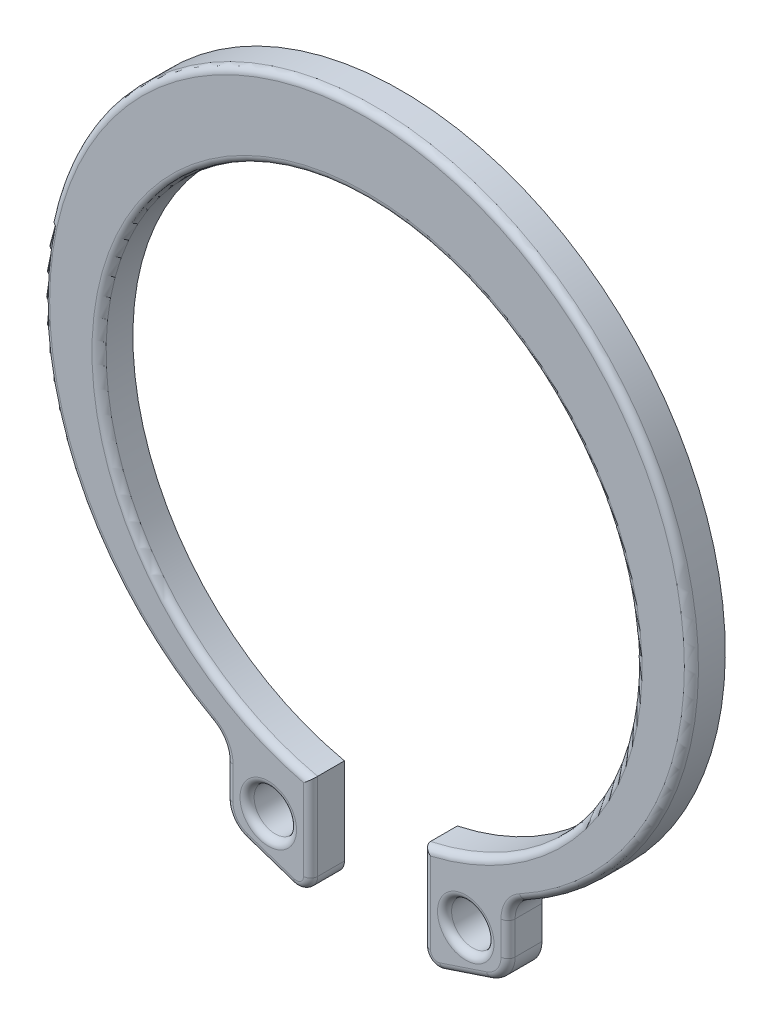
ISO-10303-21;
HEADER;
FILE_DESCRIPTION(('STEP AP214'),'2;1');
FILE_NAME('part.step','',(''),(''),'','','');
FILE_SCHEMA(('AUTOMOTIVE_DESIGN { 1 0 10303 214 1 1 1 1 }'));
ENDSEC;
DATA;
#1=APPLICATION_CONTEXT('core data for automotive mechanical design processes');
#2=APPLICATION_PROTOCOL_DEFINITION('international standard','automotive_design',2000,#1);
#3=PRODUCT_CONTEXT('',#1,'mechanical');
#4=PRODUCT('Part','Part','',(#3));
#5=PRODUCT_RELATED_PRODUCT_CATEGORY('part','',(#4));
#6=PRODUCT_DEFINITION_FORMATION('','',#4);
#7=PRODUCT_DEFINITION_CONTEXT('part definition',#1,'design');
#8=PRODUCT_DEFINITION('design','',#6,#7);
#9=PRODUCT_DEFINITION_SHAPE('','',#8);
#10=(LENGTH_UNIT() NAMED_UNIT(*) SI_UNIT(.MILLI.,.METRE.));
#11=(NAMED_UNIT(*) PLANE_ANGLE_UNIT() SI_UNIT($,.RADIAN.));
#12=(NAMED_UNIT(*) SI_UNIT($,.STERADIAN.) SOLID_ANGLE_UNIT());
#13=UNCERTAINTY_MEASURE_WITH_UNIT(LENGTH_MEASURE(1.E-05),#10,'distance_accuracy_value','');
#14=(GEOMETRIC_REPRESENTATION_CONTEXT(3) GLOBAL_UNCERTAINTY_ASSIGNED_CONTEXT((#13)) GLOBAL_UNIT_ASSIGNED_CONTEXT((#10,
#11,#12)) REPRESENTATION_CONTEXT('',''));
#15=CARTESIAN_POINT('',(0.,0.,0.));
#16=DIRECTION('',(0.,0.,1.));
#17=DIRECTION('',(1.,0.,0.));
#18=AXIS2_PLACEMENT_3D('',#15,#16,#17);
#19=CARTESIAN_POINT('',(-6.,-10.1658560997307,1.2));
#20=DIRECTION('',(0.,0.,1.));
#21=DIRECTION('',(1.,0.,0.));
#22=AXIS2_PLACEMENT_3D('',#19,#20,#21);
#23=PLANE('',#22);
#24=CARTESIAN_POINT('',(3.5,-11.056157588604,1.2));
#25=DIRECTION('',(0.,0.,1.));
#26=DIRECTION('',(1.,0.,0.));
#27=AXIS2_PLACEMENT_3D('',#24,#25,#26);
#28=CIRCLE('',#27,1.00163990877947);
#29=CARTESIAN_POINT('',(4.50163990877946,-11.056157588604,1.2));
#30=VERTEX_POINT('',#29);
#31=EDGE_CURVE('E304',#30,#30,#28,.F.);
#32=ORIENTED_EDGE('',*,*,#31,.T.);
#33=EDGE_LOOP('',(#32));
#34=FACE_BOUND('',#33,.T.);
#35=CARTESIAN_POINT('',(6.,-10.1658560997307,1.2));
#36=DIRECTION('',(0.,0.,1.));
#37=DIRECTION('',(1.,0.,0.));
#38=AXIS2_PLACEMENT_3D('',#35,#36,#37);
#39=CIRCLE('',#38,1.25);
#40=CARTESIAN_POINT('',(4.75,-10.1658560997307,1.2));
#41=VERTEX_POINT('',#40);
#42=CARTESIAN_POINT('',(5.4,-9.06927048975759,1.2));
#43=VERTEX_POINT('',#42);
#44=EDGE_CURVE('E299',#41,#43,#39,.F.);
#45=ORIENTED_EDGE('',*,*,#44,.T.);
#46=CARTESIAN_POINT('',(0.,0.8,1.2));
#47=DIRECTION('',(0.,0.,1.));
#48=DIRECTION('',(1.,0.,0.));
#49=AXIS2_PLACEMENT_3D('',#46,#47,#48);
#50=CIRCLE('',#49,11.25);
#51=CARTESIAN_POINT('',(-5.4,-9.06927048975759,1.2));
#52=VERTEX_POINT('',#51);
#53=EDGE_CURVE('E301',#43,#52,#50,.T.);
#54=ORIENTED_EDGE('',*,*,#53,.T.);
#55=CARTESIAN_POINT('',(-6.,-10.1658560997307,1.2));
#56=DIRECTION('',(0.,0.,1.));
#57=DIRECTION('',(1.,0.,0.));
#58=AXIS2_PLACEMENT_3D('',#55,#56,#57);
#59=CIRCLE('',#58,1.25);
#60=CARTESIAN_POINT('',(-4.75,-10.1658560997307,1.2));
#61=VERTEX_POINT('',#60);
#62=EDGE_CURVE('E275',#52,#61,#59,.F.);
#63=ORIENTED_EDGE('',*,*,#62,.T.);
#64=DIRECTION('',(0.,-1.,0.));
#65=VECTOR('',#64,1.);
#66=CARTESIAN_POINT('',(-4.75,-11.3353983685479,1.2));
#67=LINE('',#66,#65);
#68=CARTESIAN_POINT('',(-4.75,-11.3353983685479,1.2));
#69=VERTEX_POINT('',#68);
#70=EDGE_CURVE('E277',#61,#69,#67,.T.);
#71=ORIENTED_EDGE('',*,*,#70,.T.);
#72=CARTESIAN_POINT('',(-4.,-11.3353983685479,1.2));
#73=DIRECTION('',(0.,0.,1.));
#74=DIRECTION('',(1.,0.,0.));
#75=AXIS2_PLACEMENT_3D('',#72,#73,#74);
#76=CIRCLE('',#75,0.75);
#77=CARTESIAN_POINT('',(-4.23717082451262,-12.0469108420858,1.2));
#78=VERTEX_POINT('',#77);
#79=EDGE_CURVE('E279',#69,#78,#76,.T.);
#80=ORIENTED_EDGE('',*,*,#79,.T.);
#81=DIRECTION('',(0.948683298050514,-0.316227766016838,0.));
#82=VECTOR('',#81,1.);
#83=CARTESIAN_POINT('',(-2.57905694150421,-12.5996154697552,1.2));
#84=LINE('',#83,#82);
#85=CARTESIAN_POINT('',(-2.57905694150421,-12.5996154697552,1.2));
#86=VERTEX_POINT('',#85);
#87=EDGE_CURVE('E281',#78,#86,#84,.T.);
#88=ORIENTED_EDGE('',*,*,#87,.T.);
#89=CARTESIAN_POINT('',(-2.5,-12.3624446452426,1.2));
#90=DIRECTION('',(0.,0.,1.));
#91=DIRECTION('',(1.,0.,0.));
#92=AXIS2_PLACEMENT_3D('',#89,#90,#91);
#93=CIRCLE('',#92,0.250000000000001);
#94=CARTESIAN_POINT('',(-2.25,-12.3624446452426,1.2));
#95=VERTEX_POINT('',#94);
#96=EDGE_CURVE('E283',#86,#95,#93,.T.);
#97=ORIENTED_EDGE('',*,*,#96,.T.);
#98=DIRECTION('',(0.,1.,0.));
#99=VECTOR('',#98,1.);
#100=CARTESIAN_POINT('',(-2.25,-9.28708781050335,1.2));
#101=LINE('',#100,#99);
#102=CARTESIAN_POINT('',(-2.25,-9.48683298050514,1.2));
#103=VERTEX_POINT('',#102);
#104=EDGE_CURVE('E285',#95,#103,#101,.T.);
#105=ORIENTED_EDGE('',*,*,#104,.T.);
#106=CARTESIAN_POINT('',(0.,0.,1.2));
#107=DIRECTION('',(0.,0.,1.));
#108=DIRECTION('',(1.,0.,0.));
#109=AXIS2_PLACEMENT_3D('',#106,#107,#108);
#110=CIRCLE('',#109,9.75);
#111=CARTESIAN_POINT('',(2.25000000000001,-9.48683298050514,1.2));
#112=VERTEX_POINT('',#111);
#113=EDGE_CURVE('E287',#103,#112,#110,.F.);
#114=ORIENTED_EDGE('',*,*,#113,.T.);
#115=DIRECTION('',(0.,-1.,0.));
#116=VECTOR('',#115,1.);
#117=CARTESIAN_POINT('',(2.25,-12.3624446452426,1.2));
#118=LINE('',#117,#116);
#119=CARTESIAN_POINT('',(2.25,-12.3624446452426,1.2));
#120=VERTEX_POINT('',#119);
#121=EDGE_CURVE('E289',#112,#120,#118,.T.);
#122=ORIENTED_EDGE('',*,*,#121,.T.);
#123=CARTESIAN_POINT('',(2.5,-12.3624446452426,1.2));
#124=DIRECTION('',(0.,0.,1.));
#125=DIRECTION('',(1.,0.,0.));
#126=AXIS2_PLACEMENT_3D('',#123,#124,#125);
#127=CIRCLE('',#126,0.25);
#128=CARTESIAN_POINT('',(2.57905694150421,-12.5996154697552,1.2));
#129=VERTEX_POINT('',#128);
#130=EDGE_CURVE('E291',#120,#129,#127,.T.);
#131=ORIENTED_EDGE('',*,*,#130,.T.);
#132=DIRECTION('',(0.948683298050514,0.316227766016837,0.));
#133=VECTOR('',#132,1.);
#134=CARTESIAN_POINT('',(4.23717082451262,-12.0469108420858,1.2));
#135=LINE('',#134,#133);
#136=CARTESIAN_POINT('',(4.23717082451262,-12.0469108420858,1.2));
#137=VERTEX_POINT('',#136);
#138=EDGE_CURVE('E293',#129,#137,#135,.T.);
#139=ORIENTED_EDGE('',*,*,#138,.T.);
#140=CARTESIAN_POINT('',(4.,-11.3353983685479,1.2));
#141=DIRECTION('',(0.,0.,1.));
#142=DIRECTION('',(1.,0.,0.));
#143=AXIS2_PLACEMENT_3D('',#140,#141,#142);
#144=CIRCLE('',#143,0.75);
#145=CARTESIAN_POINT('',(4.75,-11.3353983685479,1.2));
#146=VERTEX_POINT('',#145);
#147=EDGE_CURVE('E295',#137,#146,#144,.T.);
#148=ORIENTED_EDGE('',*,*,#147,.T.);
#149=DIRECTION('',(0.,1.,0.));
#150=VECTOR('',#149,1.);
#151=CARTESIAN_POINT('',(4.75,-10.1658560997307,1.2));
#152=LINE('',#151,#150);
#153=EDGE_CURVE('E297',#146,#41,#152,.T.);
#154=ORIENTED_EDGE('',*,*,#153,.T.);
#155=EDGE_LOOP('',(#45,#54,#63,#71,#80,#88,#97,#105,#114,#122,#131,#139,#148,#154));
#156=FACE_BOUND('',#155,.T.);
#157=CARTESIAN_POINT('',(-3.5,-11.056157588604,1.2));
#158=DIRECTION('',(0.,0.,1.));
#159=DIRECTION('',(1.,0.,0.));
#160=AXIS2_PLACEMENT_3D('',#157,#158,#159);
#161=CIRCLE('',#160,1.00163990877947);
#162=CARTESIAN_POINT('',(-2.49836009122053,-11.056157588604,1.2));
#163=VERTEX_POINT('',#162);
#164=EDGE_CURVE('E272',#163,#163,#161,.F.);
#165=ORIENTED_EDGE('',*,*,#164,.T.);
#166=EDGE_LOOP('',(#165));
#167=FACE_BOUND('',#166,.T.);
#168=ADVANCED_FACE('F32',(#34,#156,#167),#23,.T.);
#169=CARTESIAN_POINT('',(-6.,-10.1658560997307,0.));
#170=DIRECTION('',(0.,0.,1.));
#171=DIRECTION('',(1.,0.,0.));
#172=AXIS2_PLACEMENT_3D('',#169,#170,#171);
#173=PLANE('',#172);
#174=CARTESIAN_POINT('',(-6.,-10.1658560997307,0.));
#175=DIRECTION('',(0.,0.,-1.));
#176=DIRECTION('',(1.,0.,0.));
#177=AXIS2_PLACEMENT_3D('',#174,#175,#176);
#178=CIRCLE('',#177,1.);
#179=CARTESIAN_POINT('',(-5.52,-9.28858761175221,0.));
#180=VERTEX_POINT('',#179);
#181=CARTESIAN_POINT('',(-5.,-10.1658560997307,0.));
#182=VERTEX_POINT('',#181);
#183=EDGE_CURVE('E197',#180,#182,#178,.T.);
#184=ORIENTED_EDGE('',*,*,#183,.F.);
#185=CARTESIAN_POINT('',(0.,0.8,0.));
#186=DIRECTION('',(0.,0.,1.));
#187=DIRECTION('',(1.,0.,0.));
#188=AXIS2_PLACEMENT_3D('',#185,#186,#187);
#189=CIRCLE('',#188,11.5);
#190=CARTESIAN_POINT('',(5.52,-9.28858761175221,0.));
#191=VERTEX_POINT('',#190);
#192=EDGE_CURVE('E244',#191,#180,#189,.T.);
#193=ORIENTED_EDGE('',*,*,#192,.F.);
#194=CARTESIAN_POINT('',(6.,-10.1658560997307,0.));
#195=DIRECTION('',(0.,0.,-1.));
#196=DIRECTION('',(-1.,0.,0.));
#197=AXIS2_PLACEMENT_3D('',#194,#195,#196);
#198=CIRCLE('',#197,1.);
#199=CARTESIAN_POINT('',(5.,-10.1658560997307,0.));
#200=VERTEX_POINT('',#199);
#201=EDGE_CURVE('E241',#200,#191,#198,.T.);
#202=ORIENTED_EDGE('',*,*,#201,.F.);
#203=DIRECTION('',(0.,1.,0.));
#204=VECTOR('',#203,1.);
#205=CARTESIAN_POINT('',(5.,-11.3353983685479,0.));
#206=LINE('',#205,#204);
#207=CARTESIAN_POINT('',(5.,-11.3353983685479,0.));
#208=VERTEX_POINT('',#207);
#209=EDGE_CURVE('E238',#208,#200,#206,.T.);
#210=ORIENTED_EDGE('',*,*,#209,.F.);
#211=CARTESIAN_POINT('',(4.,-11.3353983685479,0.));
#212=DIRECTION('',(0.,0.,1.));
#213=DIRECTION('',(-1.,0.,0.));
#214=AXIS2_PLACEMENT_3D('',#211,#212,#213);
#215=CIRCLE('',#214,1.);
#216=CARTESIAN_POINT('',(4.31622776601683,-12.2840816665984,0.));
#217=VERTEX_POINT('',#216);
#218=EDGE_CURVE('E235',#217,#208,#215,.T.);
#219=ORIENTED_EDGE('',*,*,#218,.F.);
#220=DIRECTION('',(0.948683298050514,0.316227766016837,0.));
#221=VECTOR('',#220,1.);
#222=CARTESIAN_POINT('',(2.65811388300842,-12.8367862942678,0.));
#223=LINE('',#222,#221);
#224=CARTESIAN_POINT('',(2.65811388300842,-12.8367862942678,0.));
#225=VERTEX_POINT('',#224);
#226=EDGE_CURVE('E232',#225,#217,#223,.T.);
#227=ORIENTED_EDGE('',*,*,#226,.F.);
#228=CARTESIAN_POINT('',(2.5,-12.3624446452426,0.));
#229=DIRECTION('',(0.,0.,1.));
#230=DIRECTION('',(-1.,0.,0.));
#231=AXIS2_PLACEMENT_3D('',#228,#229,#230);
#232=CIRCLE('',#231,0.5);
#233=CARTESIAN_POINT('',(2.,-12.3624446452426,0.));
#234=VERTEX_POINT('',#233);
#235=EDGE_CURVE('E229',#234,#225,#232,.T.);
#236=ORIENTED_EDGE('',*,*,#235,.F.);
#237=DIRECTION('',(0.,-1.,0.));
#238=VECTOR('',#237,1.);
#239=CARTESIAN_POINT('',(2.,-10.5247516529061,0.));
#240=LINE('',#239,#238);
#241=CARTESIAN_POINT('',(2.,-9.28708781050335,0.));
#242=VERTEX_POINT('',#241);
#243=EDGE_CURVE('E226',#242,#234,#240,.T.);
#244=ORIENTED_EDGE('',*,*,#243,.F.);
#245=CARTESIAN_POINT('',(0.,0.,0.));
#246=DIRECTION('',(0.,0.,-1.));
#247=DIRECTION('',(1.,0.,0.));
#248=AXIS2_PLACEMENT_3D('',#245,#246,#247);
#249=CIRCLE('',#248,9.5);
#250=CARTESIAN_POINT('',(-2.,-9.28708781050335,0.));
#251=VERTEX_POINT('',#250);
#252=EDGE_CURVE('E223',#251,#242,#249,.T.);
#253=ORIENTED_EDGE('',*,*,#252,.F.);
#254=DIRECTION('',(0.,1.,0.));
#255=VECTOR('',#254,1.);
#256=CARTESIAN_POINT('',(-2.,-9.28708781050335,0.));
#257=LINE('',#256,#255);
#258=CARTESIAN_POINT('',(-2.,-12.3624446452426,0.));
#259=VERTEX_POINT('',#258);
#260=EDGE_CURVE('E220',#259,#251,#257,.T.);
#261=ORIENTED_EDGE('',*,*,#260,.F.);
#262=CARTESIAN_POINT('',(-2.5,-12.3624446452426,0.));
#263=DIRECTION('',(0.,0.,1.));
#264=DIRECTION('',(-1.,0.,0.));
#265=AXIS2_PLACEMENT_3D('',#262,#263,#264);
#266=CIRCLE('',#265,0.500000000000001);
#267=CARTESIAN_POINT('',(-2.65811388300842,-12.8367862942679,0.));
#268=VERTEX_POINT('',#267);
#269=EDGE_CURVE('E217',#268,#259,#266,.T.);
#270=ORIENTED_EDGE('',*,*,#269,.F.);
#271=DIRECTION('',(0.948683298050514,-0.316227766016838,0.));
#272=VECTOR('',#271,1.);
#273=CARTESIAN_POINT('',(-2.65811388300842,-12.8367862942679,0.));
#274=LINE('',#273,#272);
#275=CARTESIAN_POINT('',(-4.31622776601683,-12.2840816665984,0.));
#276=VERTEX_POINT('',#275);
#277=EDGE_CURVE('E214',#276,#268,#274,.T.);
#278=ORIENTED_EDGE('',*,*,#277,.F.);
#279=CARTESIAN_POINT('',(-4.,-11.3353983685479,0.));
#280=DIRECTION('',(0.,0.,1.));
#281=DIRECTION('',(-1.,0.,0.));
#282=AXIS2_PLACEMENT_3D('',#279,#280,#281);
#283=CIRCLE('',#282,1.);
#284=CARTESIAN_POINT('',(-5.,-11.3353983685479,0.));
#285=VERTEX_POINT('',#284);
#286=EDGE_CURVE('E200',#285,#276,#283,.T.);
#287=ORIENTED_EDGE('',*,*,#286,.F.);
#288=DIRECTION('',(0.,-1.,0.));
#289=VECTOR('',#288,1.);
#290=CARTESIAN_POINT('',(-5.,-11.3353983685479,0.));
#291=LINE('',#290,#289);
#292=EDGE_CURVE('E184',#182,#285,#291,.T.);
#293=ORIENTED_EDGE('',*,*,#292,.F.);
#294=EDGE_LOOP('',(#184,#193,#202,#210,#219,#227,#236,#244,#253,#261,#270,#278,#287,#293));
#295=FACE_BOUND('',#294,.T.);
#296=CARTESIAN_POINT('',(-3.5,-11.056157588604,0.));
#297=DIRECTION('',(0.,0.,1.));
#298=DIRECTION('',(1.,0.,0.));
#299=AXIS2_PLACEMENT_3D('',#296,#297,#298);
#300=CIRCLE('',#299,0.751639908779466);
#301=CARTESIAN_POINT('',(-2.74836009122053,-11.056157588604,0.));
#302=VERTEX_POINT('',#301);
#303=EDGE_CURVE('E206',#302,#302,#300,.T.);
#304=ORIENTED_EDGE('',*,*,#303,.T.);
#305=EDGE_LOOP('',(#304));
#306=FACE_BOUND('',#305,.T.);
#307=CARTESIAN_POINT('',(3.5,-11.056157588604,0.));
#308=DIRECTION('',(0.,0.,1.));
#309=DIRECTION('',(-1.,0.,0.));
#310=AXIS2_PLACEMENT_3D('',#307,#308,#309);
#311=CIRCLE('',#310,0.751639908779466);
#312=CARTESIAN_POINT('',(2.74836009122053,-11.056157588604,0.));
#313=VERTEX_POINT('',#312);
#314=EDGE_CURVE('E209',#313,#313,#311,.T.);
#315=ORIENTED_EDGE('',*,*,#314,.T.);
#316=EDGE_LOOP('',(#315));
#317=FACE_BOUND('',#316,.T.);
#318=ADVANCED_FACE('F194',(#295,#306,#317),#173,.F.);
#319=CARTESIAN_POINT('',(-6.,-10.1658560997307,1.2));
#320=DIRECTION('',(0.,0.,-1.));
#321=DIRECTION('',(-1.,0.,0.));
#322=AXIS2_PLACEMENT_3D('',#319,#320,#321);
#323=CYLINDRICAL_SURFACE('',#322,1.);
#324=DIRECTION('',(0.,0.,-1.));
#325=VECTOR('',#324,1.);
#326=CARTESIAN_POINT('',(-5.,-10.1658560997307,1.2));
#327=LINE('',#326,#325);
#328=CARTESIAN_POINT('',(-5.,-10.1658560997307,0.95));
#329=VERTEX_POINT('',#328);
#330=EDGE_CURVE('E181',#329,#182,#327,.T.);
#331=ORIENTED_EDGE('',*,*,#330,.F.);
#332=CARTESIAN_POINT('',(-6.,-10.1658560997307,0.95));
#333=DIRECTION('',(0.,0.,1.));
#334=DIRECTION('',(1.,0.,0.));
#335=AXIS2_PLACEMENT_3D('',#332,#333,#334);
#336=CIRCLE('',#335,1.);
#337=CARTESIAN_POINT('',(-5.52,-9.28858761175221,0.95));
#338=VERTEX_POINT('',#337);
#339=EDGE_CURVE('E46',#329,#338,#336,.T.);
#340=ORIENTED_EDGE('',*,*,#339,.T.);
#341=DIRECTION('',(0.,0.,-1.));
#342=VECTOR('',#341,1.);
#343=CARTESIAN_POINT('',(-5.52,-9.28858761175221,1.2));
#344=LINE('',#343,#342);
#345=EDGE_CURVE('E204',#338,#180,#344,.T.);
#346=ORIENTED_EDGE('',*,*,#345,.T.);
#347=ORIENTED_EDGE('',*,*,#183,.T.);
#348=EDGE_LOOP('',(#331,#340,#346,#347));
#349=FACE_BOUND('',#348,.T.);
#350=ADVANCED_FACE('F202',(#349),#323,.F.);
#351=CARTESIAN_POINT('',(-5.,-11.3353983685479,1.2));
#352=DIRECTION('',(1.,0.,0.));
#353=DIRECTION('',(0.,1.,0.));
#354=AXIS2_PLACEMENT_3D('',#351,#352,#353);
#355=PLANE('',#354);
#356=DIRECTION('',(0.,0.,-1.));
#357=VECTOR('',#356,1.);
#358=CARTESIAN_POINT('',(-5.,-11.3353983685479,1.2));
#359=LINE('',#358,#357);
#360=CARTESIAN_POINT('',(-5.,-11.3353983685479,0.95));
#361=VERTEX_POINT('',#360);
#362=EDGE_CURVE('E190',#361,#285,#359,.T.);
#363=ORIENTED_EDGE('',*,*,#362,.F.);
#364=DIRECTION('',(0.,-1.,0.));
#365=VECTOR('',#364,1.);
#366=CARTESIAN_POINT('',(-5.,-10.1658560997307,0.95));
#367=LINE('',#366,#365);
#368=EDGE_CURVE('E54',#361,#329,#367,.F.);
#369=ORIENTED_EDGE('',*,*,#368,.T.);
#370=ORIENTED_EDGE('',*,*,#330,.T.);
#371=ORIENTED_EDGE('',*,*,#292,.T.);
#372=EDGE_LOOP('',(#363,#369,#370,#371));
#373=FACE_BOUND('',#372,.T.);
#374=ADVANCED_FACE('F183',(#373),#355,.F.);
#375=CARTESIAN_POINT('',(-4.,-11.3353983685479,1.2));
#376=DIRECTION('',(0.,0.,-1.));
#377=DIRECTION('',(-1.,0.,0.));
#378=AXIS2_PLACEMENT_3D('',#375,#376,#377);
#379=CYLINDRICAL_SURFACE('',#378,1.);
#380=DIRECTION('',(0.,0.,-1.));
#381=VECTOR('',#380,1.);
#382=CARTESIAN_POINT('',(-4.31622776601683,-12.2840816665984,1.2));
#383=LINE('',#382,#381);
#384=CARTESIAN_POINT('',(-4.31622776601683,-12.2840816665984,0.95));
#385=VERTEX_POINT('',#384);
#386=EDGE_CURVE('E267',#385,#276,#383,.T.);
#387=ORIENTED_EDGE('',*,*,#386,.F.);
#388=CARTESIAN_POINT('',(-4.,-11.3353983685479,0.95));
#389=DIRECTION('',(0.,0.,1.));
#390=DIRECTION('',(1.,0.,0.));
#391=AXIS2_PLACEMENT_3D('',#388,#389,#390);
#392=CIRCLE('',#391,1.);
#393=EDGE_CURVE('E62',#385,#361,#392,.F.);
#394=ORIENTED_EDGE('',*,*,#393,.T.);
#395=ORIENTED_EDGE('',*,*,#362,.T.);
#396=ORIENTED_EDGE('',*,*,#286,.T.);
#397=EDGE_LOOP('',(#387,#394,#395,#396));
#398=FACE_BOUND('',#397,.T.);
#399=ADVANCED_FACE('F447',(#398),#379,.T.);
#400=CARTESIAN_POINT('',(-2.65811388300842,-12.8367862942679,1.2));
#401=DIRECTION('',(0.316227766016838,0.948683298050514,0.));
#402=DIRECTION('',(-0.948683298050514,0.316227766016838,0.));
#403=AXIS2_PLACEMENT_3D('',#400,#401,#402);
#404=PLANE('',#403);
#405=DIRECTION('',(0.,0.,-1.));
#406=VECTOR('',#405,1.);
#407=CARTESIAN_POINT('',(-2.65811388300842,-12.8367862942679,1.2));
#408=LINE('',#407,#406);
#409=CARTESIAN_POINT('',(-2.65811388300842,-12.8367862942679,0.95));
#410=VERTEX_POINT('',#409);
#411=EDGE_CURVE('E265',#410,#268,#408,.T.);
#412=ORIENTED_EDGE('',*,*,#411,.F.);
#413=DIRECTION('',(0.948683298050514,-0.316227766016838,0.));
#414=VECTOR('',#413,1.);
#415=CARTESIAN_POINT('',(-4.31622776601683,-12.2840816665984,0.95));
#416=LINE('',#415,#414);
#417=EDGE_CURVE('E328',#410,#385,#416,.F.);
#418=ORIENTED_EDGE('',*,*,#417,.T.);
#419=ORIENTED_EDGE('',*,*,#386,.T.);
#420=ORIENTED_EDGE('',*,*,#277,.T.);
#421=EDGE_LOOP('',(#412,#418,#419,#420));
#422=FACE_BOUND('',#421,.T.);
#423=ADVANCED_FACE('F443',(#422),#404,.F.);
#424=CARTESIAN_POINT('',(-2.5,-12.3624446452426,1.2));
#425=DIRECTION('',(0.,0.,-1.));
#426=DIRECTION('',(-1.,0.,0.));
#427=AXIS2_PLACEMENT_3D('',#424,#425,#426);
#428=CYLINDRICAL_SURFACE('',#427,0.500000000000001);
#429=DIRECTION('',(0.,0.,-1.));
#430=VECTOR('',#429,1.);
#431=CARTESIAN_POINT('',(-2.,-12.3624446452426,1.2));
#432=LINE('',#431,#430);
#433=CARTESIAN_POINT('',(-2.,-12.3624446452426,0.95));
#434=VERTEX_POINT('',#433);
#435=EDGE_CURVE('E263',#434,#259,#432,.T.);
#436=ORIENTED_EDGE('',*,*,#435,.F.);
#437=CARTESIAN_POINT('',(-2.5,-12.3624446452426,0.95));
#438=DIRECTION('',(0.,0.,1.));
#439=DIRECTION('',(1.,0.,0.));
#440=AXIS2_PLACEMENT_3D('',#437,#438,#439);
#441=CIRCLE('',#440,0.500000000000001);
#442=EDGE_CURVE('E326',#434,#410,#441,.F.);
#443=ORIENTED_EDGE('',*,*,#442,.T.);
#444=ORIENTED_EDGE('',*,*,#411,.T.);
#445=ORIENTED_EDGE('',*,*,#269,.T.);
#446=EDGE_LOOP('',(#436,#443,#444,#445));
#447=FACE_BOUND('',#446,.T.);
#448=ADVANCED_FACE('F439',(#447),#428,.T.);
#449=CARTESIAN_POINT('',(-2.,-9.28708781050335,1.2));
#450=DIRECTION('',(-1.,0.,0.));
#451=DIRECTION('',(0.,0.,1.));
#452=AXIS2_PLACEMENT_3D('',#449,#450,#451);
#453=PLANE('',#452);
#454=DIRECTION('',(0.,0.,-1.));
#455=VECTOR('',#454,1.);
#456=CARTESIAN_POINT('',(-2.,-9.28708781050335,1.2));
#457=LINE('',#456,#455);
#458=CARTESIAN_POINT('',(-2.,-9.28708781050335,0.95));
#459=VERTEX_POINT('',#458);
#460=EDGE_CURVE('E261',#459,#251,#457,.T.);
#461=ORIENTED_EDGE('',*,*,#460,.F.);
#462=DIRECTION('',(0.,1.,0.));
#463=VECTOR('',#462,1.);
#464=CARTESIAN_POINT('',(-2.,-12.3624446452426,0.95));
#465=LINE('',#464,#463);
#466=EDGE_CURVE('E324',#459,#434,#465,.F.);
#467=ORIENTED_EDGE('',*,*,#466,.T.);
#468=ORIENTED_EDGE('',*,*,#435,.T.);
#469=ORIENTED_EDGE('',*,*,#260,.T.);
#470=EDGE_LOOP('',(#461,#467,#468,#469));
#471=FACE_BOUND('',#470,.T.);
#472=ADVANCED_FACE('F435',(#471),#453,.F.);
#473=CARTESIAN_POINT('',(0.,0.,1.2));
#474=DIRECTION('',(0.,0.,-1.));
#475=DIRECTION('',(-1.,0.,0.));
#476=AXIS2_PLACEMENT_3D('',#473,#474,#475);
#477=CYLINDRICAL_SURFACE('',#476,9.5);
#478=DIRECTION('',(0.,0.,-1.));
#479=VECTOR('',#478,1.);
#480=CARTESIAN_POINT('',(2.,-9.28708781050335,1.2));
#481=LINE('',#480,#479);
#482=CARTESIAN_POINT('',(2.,-9.28708781050335,0.95));
#483=VERTEX_POINT('',#482);
#484=EDGE_CURVE('E259',#483,#242,#481,.T.);
#485=ORIENTED_EDGE('',*,*,#484,.F.);
#486=CARTESIAN_POINT('',(0.,0.,0.95));
#487=DIRECTION('',(0.,0.,1.));
#488=DIRECTION('',(1.,0.,0.));
#489=AXIS2_PLACEMENT_3D('',#486,#487,#488);
#490=CIRCLE('',#489,9.5);
#491=EDGE_CURVE('E322',#483,#459,#490,.T.);
#492=ORIENTED_EDGE('',*,*,#491,.T.);
#493=ORIENTED_EDGE('',*,*,#460,.T.);
#494=ORIENTED_EDGE('',*,*,#252,.T.);
#495=EDGE_LOOP('',(#485,#492,#493,#494));
#496=FACE_BOUND('',#495,.T.);
#497=ADVANCED_FACE('F431',(#496),#477,.F.);
#498=CARTESIAN_POINT('',(2.,-10.5247516529061,1.2));
#499=DIRECTION('',(1.,0.,0.));
#500=DIRECTION('',(0.,1.,0.));
#501=AXIS2_PLACEMENT_3D('',#498,#499,#500);
#502=PLANE('',#501);
#503=DIRECTION('',(0.,0.,-1.));
#504=VECTOR('',#503,1.);
#505=CARTESIAN_POINT('',(2.,-12.3624446452426,1.2));
#506=LINE('',#505,#504);
#507=CARTESIAN_POINT('',(2.,-12.3624446452426,0.95));
#508=VERTEX_POINT('',#507);
#509=EDGE_CURVE('E257',#508,#234,#506,.T.);
#510=ORIENTED_EDGE('',*,*,#509,.F.);
#511=DIRECTION('',(0.,-1.,0.));
#512=VECTOR('',#511,1.);
#513=CARTESIAN_POINT('',(2.00000000000001,-9.28708781050335,0.95));
#514=LINE('',#513,#512);
#515=EDGE_CURVE('E320',#508,#483,#514,.F.);
#516=ORIENTED_EDGE('',*,*,#515,.T.);
#517=ORIENTED_EDGE('',*,*,#484,.T.);
#518=ORIENTED_EDGE('',*,*,#243,.T.);
#519=EDGE_LOOP('',(#510,#516,#517,#518));
#520=FACE_BOUND('',#519,.T.);
#521=ADVANCED_FACE('F427',(#520),#502,.F.);
#522=CARTESIAN_POINT('',(2.5,-12.3624446452426,1.2));
#523=DIRECTION('',(0.,0.,-1.));
#524=DIRECTION('',(-1.,0.,0.));
#525=AXIS2_PLACEMENT_3D('',#522,#523,#524);
#526=CYLINDRICAL_SURFACE('',#525,0.5);
#527=DIRECTION('',(0.,0.,-1.));
#528=VECTOR('',#527,1.);
#529=CARTESIAN_POINT('',(2.65811388300842,-12.8367862942678,1.2));
#530=LINE('',#529,#528);
#531=CARTESIAN_POINT('',(2.65811388300842,-12.8367862942678,0.95));
#532=VERTEX_POINT('',#531);
#533=EDGE_CURVE('E255',#532,#225,#530,.T.);
#534=ORIENTED_EDGE('',*,*,#533,.F.);
#535=CARTESIAN_POINT('',(2.5,-12.3624446452426,0.95));
#536=DIRECTION('',(0.,0.,1.));
#537=DIRECTION('',(1.,0.,0.));
#538=AXIS2_PLACEMENT_3D('',#535,#536,#537);
#539=CIRCLE('',#538,0.5);
#540=EDGE_CURVE('E318',#532,#508,#539,.F.);
#541=ORIENTED_EDGE('',*,*,#540,.T.);
#542=ORIENTED_EDGE('',*,*,#509,.T.);
#543=ORIENTED_EDGE('',*,*,#235,.T.);
#544=EDGE_LOOP('',(#534,#541,#542,#543));
#545=FACE_BOUND('',#544,.T.);
#546=ADVANCED_FACE('F423',(#545),#526,.T.);
#547=CARTESIAN_POINT('',(2.65811388300842,-12.8367862942678,1.2));
#548=DIRECTION('',(-0.316227766016837,0.948683298050514,0.));
#549=DIRECTION('',(-0.948683298050514,-0.316227766016837,0.));
#550=AXIS2_PLACEMENT_3D('',#547,#548,#549);
#551=PLANE('',#550);
#552=DIRECTION('',(0.,0.,-1.));
#553=VECTOR('',#552,1.);
#554=CARTESIAN_POINT('',(4.31622776601683,-12.2840816665984,1.2));
#555=LINE('',#554,#553);
#556=CARTESIAN_POINT('',(4.31622776601683,-12.2840816665984,0.95));
#557=VERTEX_POINT('',#556);
#558=EDGE_CURVE('E253',#557,#217,#555,.T.);
#559=ORIENTED_EDGE('',*,*,#558,.F.);
#560=DIRECTION('',(0.948683298050514,0.316227766016837,0.));
#561=VECTOR('',#560,1.);
#562=CARTESIAN_POINT('',(2.65811388300842,-12.8367862942678,0.95));
#563=LINE('',#562,#561);
#564=EDGE_CURVE('E316',#557,#532,#563,.F.);
#565=ORIENTED_EDGE('',*,*,#564,.T.);
#566=ORIENTED_EDGE('',*,*,#533,.T.);
#567=ORIENTED_EDGE('',*,*,#226,.T.);
#568=EDGE_LOOP('',(#559,#565,#566,#567));
#569=FACE_BOUND('',#568,.T.);
#570=ADVANCED_FACE('F419',(#569),#551,.F.);
#571=CARTESIAN_POINT('',(4.,-11.3353983685479,1.2));
#572=DIRECTION('',(0.,0.,-1.));
#573=DIRECTION('',(-1.,0.,0.));
#574=AXIS2_PLACEMENT_3D('',#571,#572,#573);
#575=CYLINDRICAL_SURFACE('',#574,1.);
#576=DIRECTION('',(0.,0.,-1.));
#577=VECTOR('',#576,1.);
#578=CARTESIAN_POINT('',(5.,-11.3353983685479,1.2));
#579=LINE('',#578,#577);
#580=CARTESIAN_POINT('',(5.,-11.3353983685479,0.95));
#581=VERTEX_POINT('',#580);
#582=EDGE_CURVE('E251',#581,#208,#579,.T.);
#583=ORIENTED_EDGE('',*,*,#582,.F.);
#584=CARTESIAN_POINT('',(4.,-11.3353983685479,0.95));
#585=DIRECTION('',(0.,0.,1.));
#586=DIRECTION('',(1.,0.,0.));
#587=AXIS2_PLACEMENT_3D('',#584,#585,#586);
#588=CIRCLE('',#587,1.);
#589=EDGE_CURVE('E314',#581,#557,#588,.F.);
#590=ORIENTED_EDGE('',*,*,#589,.T.);
#591=ORIENTED_EDGE('',*,*,#558,.T.);
#592=ORIENTED_EDGE('',*,*,#218,.T.);
#593=EDGE_LOOP('',(#583,#590,#591,#592));
#594=FACE_BOUND('',#593,.T.);
#595=ADVANCED_FACE('F415',(#594),#575,.T.);
#596=CARTESIAN_POINT('',(5.,-11.3353983685479,1.2));
#597=DIRECTION('',(-1.,0.,0.));
#598=DIRECTION('',(0.,-1.,0.));
#599=AXIS2_PLACEMENT_3D('',#596,#597,#598);
#600=PLANE('',#599);
#601=DIRECTION('',(0.,0.,-1.));
#602=VECTOR('',#601,1.);
#603=CARTESIAN_POINT('',(5.,-10.1658560997307,1.2));
#604=LINE('',#603,#602);
#605=CARTESIAN_POINT('',(5.,-10.1658560997307,0.95));
#606=VERTEX_POINT('',#605);
#607=EDGE_CURVE('E249',#606,#200,#604,.T.);
#608=ORIENTED_EDGE('',*,*,#607,.F.);
#609=DIRECTION('',(0.,1.,0.));
#610=VECTOR('',#609,1.);
#611=CARTESIAN_POINT('',(5.,-11.3353983685479,0.95));
#612=LINE('',#611,#610);
#613=EDGE_CURVE('E312',#606,#581,#612,.F.);
#614=ORIENTED_EDGE('',*,*,#613,.T.);
#615=ORIENTED_EDGE('',*,*,#582,.T.);
#616=ORIENTED_EDGE('',*,*,#209,.T.);
#617=EDGE_LOOP('',(#608,#614,#615,#616));
#618=FACE_BOUND('',#617,.T.);
#619=ADVANCED_FACE('F411',(#618),#600,.F.);
#620=CARTESIAN_POINT('',(6.,-10.1658560997307,1.2));
#621=DIRECTION('',(0.,0.,-1.));
#622=DIRECTION('',(-1.,0.,0.));
#623=AXIS2_PLACEMENT_3D('',#620,#621,#622);
#624=CYLINDRICAL_SURFACE('',#623,1.);
#625=DIRECTION('',(0.,0.,-1.));
#626=VECTOR('',#625,1.);
#627=CARTESIAN_POINT('',(5.52,-9.28858761175221,1.2));
#628=LINE('',#627,#626);
#629=CARTESIAN_POINT('',(5.52,-9.28858761175221,0.95));
#630=VERTEX_POINT('',#629);
#631=EDGE_CURVE('E247',#630,#191,#628,.T.);
#632=ORIENTED_EDGE('',*,*,#631,.F.);
#633=CARTESIAN_POINT('',(6.,-10.1658560997307,0.95));
#634=DIRECTION('',(0.,0.,1.));
#635=DIRECTION('',(1.,0.,0.));
#636=AXIS2_PLACEMENT_3D('',#633,#634,#635);
#637=CIRCLE('',#636,1.);
#638=EDGE_CURVE('E310',#630,#606,#637,.T.);
#639=ORIENTED_EDGE('',*,*,#638,.T.);
#640=ORIENTED_EDGE('',*,*,#607,.T.);
#641=ORIENTED_EDGE('',*,*,#201,.T.);
#642=EDGE_LOOP('',(#632,#639,#640,#641));
#643=FACE_BOUND('',#642,.T.);
#644=ADVANCED_FACE('F407',(#643),#624,.F.);
#645=CARTESIAN_POINT('',(0.,0.8,1.2));
#646=DIRECTION('',(0.,0.,-1.));
#647=DIRECTION('',(-1.,0.,0.));
#648=AXIS2_PLACEMENT_3D('',#645,#646,#647);
#649=CYLINDRICAL_SURFACE('',#648,11.5);
#650=ORIENTED_EDGE('',*,*,#345,.F.);
#651=CARTESIAN_POINT('',(0.,0.8,0.95));
#652=DIRECTION('',(0.,0.,1.));
#653=DIRECTION('',(1.,0.,0.));
#654=AXIS2_PLACEMENT_3D('',#651,#652,#653);
#655=CIRCLE('',#654,11.5);
#656=EDGE_CURVE('E307',#338,#630,#655,.F.);
#657=ORIENTED_EDGE('',*,*,#656,.T.);
#658=ORIENTED_EDGE('',*,*,#631,.T.);
#659=ORIENTED_EDGE('',*,*,#192,.T.);
#660=EDGE_LOOP('',(#650,#657,#658,#659));
#661=FACE_BOUND('',#660,.T.);
#662=ADVANCED_FACE('F404',(#661),#649,.T.);
#663=CARTESIAN_POINT('',(-3.5,-11.056157588604,1.2));
#664=DIRECTION('',(0.,0.,-1.));
#665=DIRECTION('',(-1.,0.,0.));
#666=AXIS2_PLACEMENT_3D('',#663,#664,#665);
#667=CYLINDRICAL_SURFACE('',#666,0.751639908779466);
#668=CARTESIAN_POINT('',(-3.5,-11.056157588604,0.95));
#669=DIRECTION('',(0.,0.,1.));
#670=DIRECTION('',(1.,0.,0.));
#671=AXIS2_PLACEMENT_3D('',#668,#669,#670);
#672=CIRCLE('',#671,0.751639908779466);
#673=CARTESIAN_POINT('',(-2.74836009122053,-11.056157588604,0.95));
#674=VERTEX_POINT('',#673);
#675=EDGE_CURVE('E11',#674,#674,#672,.T.);
#676=ORIENTED_EDGE('',*,*,#675,.T.);
#677=EDGE_LOOP('',(#676));
#678=FACE_BOUND('',#677,.T.);
#679=ORIENTED_EDGE('',*,*,#303,.F.);
#680=EDGE_LOOP('',(#679));
#681=FACE_BOUND('',#680,.T.);
#682=ADVANCED_FACE('F401',(#678,#681),#667,.F.);
#683=CARTESIAN_POINT('',(3.5,-11.056157588604,1.2));
#684=DIRECTION('',(0.,0.,-1.));
#685=DIRECTION('',(-1.,0.,0.));
#686=AXIS2_PLACEMENT_3D('',#683,#684,#685);
#687=CYLINDRICAL_SURFACE('',#686,0.751639908779466);
#688=CARTESIAN_POINT('',(3.5,-11.056157588604,0.95));
#689=DIRECTION('',(0.,0.,1.));
#690=DIRECTION('',(1.,0.,0.));
#691=AXIS2_PLACEMENT_3D('',#688,#689,#690);
#692=CIRCLE('',#691,0.751639908779466);
#693=CARTESIAN_POINT('',(4.25163990877946,-11.056157588604,0.95));
#694=VERTEX_POINT('',#693);
#695=EDGE_CURVE('E189',#694,#694,#692,.T.);
#696=ORIENTED_EDGE('',*,*,#695,.T.);
#697=EDGE_LOOP('',(#696));
#698=FACE_BOUND('',#697,.T.);
#699=ORIENTED_EDGE('',*,*,#314,.F.);
#700=EDGE_LOOP('',(#699));
#701=FACE_BOUND('',#700,.T.);
#702=ADVANCED_FACE('F457',(#698,#701),#687,.F.);
#703=CARTESIAN_POINT('',(3.5,-11.056157588604,0.95));
#704=DIRECTION('',(0.,0.,1.));
#705=DIRECTION('',(1.,0.,0.));
#706=AXIS2_PLACEMENT_3D('',#703,#704,#705);
#707=TOROIDAL_SURFACE('',#706,1.00163990877947,0.25);
#708=ORIENTED_EDGE('',*,*,#31,.F.);
#709=EDGE_LOOP('',(#708));
#710=FACE_BOUND('',#709,.T.);
#711=ORIENTED_EDGE('',*,*,#695,.F.);
#712=EDGE_LOOP('',(#711));
#713=FACE_BOUND('',#712,.T.);
#714=ADVANCED_FACE('F380',(#710,#713),#707,.T.);
#715=CARTESIAN_POINT('',(0.,0.,0.95));
#716=DIRECTION('',(0.,0.,1.));
#717=DIRECTION('',(1.,0.,0.));
#718=AXIS2_PLACEMENT_3D('',#715,#716,#717);
#719=TOROIDAL_SURFACE('',#718,9.75,0.25);
#720=CARTESIAN_POINT('',(-2.,-9.28708781050335,0.95));
#721=CARTESIAN_POINT('',(-1.99998178767897,-9.28707283607693,0.961885303156753));
#722=CARTESIAN_POINT('',(-2.00084623999206,-9.28777121616426,0.97374860460598));
#723=CARTESIAN_POINT('',(-2.00418693699851,-9.29046861722009,0.997017794529973));
#724=CARTESIAN_POINT('',(-2.00665263552395,-9.29245912789119,1.00842616112313));
#725=CARTESIAN_POINT('',(-2.01303991279503,-9.29761285828697,1.03051537007557));
#726=CARTESIAN_POINT('',(-2.01695879230256,-9.3007739037649,1.04119751810302));
#727=CARTESIAN_POINT('',(-2.02604151278615,-9.30809519555054,1.0616602625644));
#728=CARTESIAN_POINT('',(-2.03120710315387,-9.3122568458812,1.07143956522401));
#729=CARTESIAN_POINT('',(-2.04300143539768,-9.3217512109463,1.09067175501856));
#730=CARTESIAN_POINT('',(-2.04971223750396,-9.32714944255034,1.1000414598118));
#731=CARTESIAN_POINT('',(-2.06407307469558,-9.33868992690622,1.11750887500261));
#732=CARTESIAN_POINT('',(-2.07172357103338,-9.34483254502302,1.1256059562472));
#733=CARTESIAN_POINT('',(-2.09167991320133,-9.36083809373985,1.14416614717484));
#734=CARTESIAN_POINT('',(-2.10443294847689,-9.37105152353196,1.1538502941675));
#735=CARTESIAN_POINT('',(-2.1310257143389,-9.39231064550737,1.17043484978336));
#736=CARTESIAN_POINT('',(-2.14486763715619,-9.40335801473669,1.17732946162705));
#737=CARTESIAN_POINT('',(-2.17334482879427,-9.42604383425966,1.18845301203251));
#738=CARTESIAN_POINT('',(-2.18798631093124,-9.43768684941994,1.19265639437825));
#739=CARTESIAN_POINT('',(-2.21758093645633,-9.46117601116937,1.19834508998038));
#740=CARTESIAN_POINT('',(-2.23253324080344,-9.47302159862216,1.19983694981898));
#741=CARTESIAN_POINT('',(-2.24832350082305,-9.48550752265409,1.19999578369123));
#742=CARTESIAN_POINT('',(-2.24916176616109,-9.48617029909209,1.1999999993825));
#743=CARTESIAN_POINT('',(-2.25,-9.48683298050514,1.2));
#744=B_SPLINE_CURVE_WITH_KNOTS('',3,(#720,#721,#722,#723,#724,#725,#726,#727,#728,#729,#730,
#731,#732,#733,#734,#735,#736,#737,#738,#739,#740,#741,#742,#743),.UNSPECIFIED.,.F.,.F.,(4,2,2,
2,2,2,2,2,2,2,2,4),(0.,0.0355692761737478,0.070906628977284,0.106178669889961,0.141500495466324,
0.179543390168773,0.217605033559053,0.274277233225869,0.331066602766138,0.388387550877332,
0.44556992100617,0.448775784759457),.UNSPECIFIED.);
#745=EDGE_CURVE('E366',#459,#103,#744,.T.);
#746=ORIENTED_EDGE('',*,*,#745,.F.);
#747=ORIENTED_EDGE('',*,*,#491,.F.);
#748=CARTESIAN_POINT('',(2.,-9.28708781050335,0.95));
#749=CARTESIAN_POINT('',(1.99998178767898,-9.28707283607693,0.961885303156753));
#750=CARTESIAN_POINT('',(2.00084623999207,-9.28777121616426,0.97374860460598));
#751=CARTESIAN_POINT('',(2.00418693699852,-9.29046861722009,0.997017794529973));
#752=CARTESIAN_POINT('',(2.00665263552396,-9.29245912789118,1.00842616112313));
#753=CARTESIAN_POINT('',(2.01303991279504,-9.29761285828696,1.03051537007557));
#754=CARTESIAN_POINT('',(2.01695879230258,-9.3007739037649,1.04119751810302));
#755=CARTESIAN_POINT('',(2.02604151278616,-9.30809519555054,1.0616602625644));
#756=CARTESIAN_POINT('',(2.03120710315388,-9.3122568458812,1.07143956522401));
#757=CARTESIAN_POINT('',(2.04300143539769,-9.3217512109463,1.09067175501856));
#758=CARTESIAN_POINT('',(2.04971223750397,-9.32714944255034,1.1000414598118));
#759=CARTESIAN_POINT('',(2.06407307469559,-9.33868992690621,1.11750887500262));
#760=CARTESIAN_POINT('',(2.07172357103339,-9.34483254502302,1.1256059562472));
#761=CARTESIAN_POINT('',(2.09167991320134,-9.36083809373985,1.14416614717484));
#762=CARTESIAN_POINT('',(2.1044329484769,-9.37105152353196,1.1538502941675));
#763=CARTESIAN_POINT('',(2.13102571433891,-9.39231064550737,1.17043484978336));
#764=CARTESIAN_POINT('',(2.1448676371562,-9.40335801473669,1.17732946162705));
#765=CARTESIAN_POINT('',(2.17334482879428,-9.42604383425965,1.18845301203251));
#766=CARTESIAN_POINT('',(2.18798631093125,-9.43768684941994,1.19265639437825));
#767=CARTESIAN_POINT('',(2.21758093645634,-9.46117601116937,1.19834508998038));
#768=CARTESIAN_POINT('',(2.23253324080345,-9.47302159862216,1.19983694981898));
#769=CARTESIAN_POINT('',(2.24832350082306,-9.48550752265408,1.19999578369123));
#770=CARTESIAN_POINT('',(2.2491617661611,-9.48617029909209,1.1999999993825));
#771=CARTESIAN_POINT('',(2.25000000000001,-9.48683298050514,1.2));
#772=B_SPLINE_CURVE_WITH_KNOTS('',3,(#748,#749,#750,#751,#752,#753,#754,#755,#756,#757,#758,
#759,#760,#761,#762,#763,#764,#765,#766,#767,#768,#769,#770,#771),.UNSPECIFIED.,.F.,.F.,(4,2,2,
2,2,2,2,2,2,2,2,4),(0.,0.0355692761737483,0.0709066289772848,0.106178669889963,
0.141500495466325,0.179543390168773,0.217605033559053,0.274277233225869,0.331066602766139,
0.388387550877331,0.445569921006167,0.448775784759457),.UNSPECIFIED.);
#773=EDGE_CURVE('E36',#112,#483,#772,.F.);
#774=ORIENTED_EDGE('',*,*,#773,.F.);
#775=ORIENTED_EDGE('',*,*,#113,.F.);
#776=EDGE_LOOP('',(#746,#747,#774,#775));
#777=FACE_BOUND('',#776,.T.);
#778=ADVANCED_FACE('F376',(#777),#719,.T.);
#779=CARTESIAN_POINT('',(2.25000000000001,-10.1658560997307,0.95));
#780=DIRECTION('',(0.,1.,0.));
#781=DIRECTION('',(-1.,0.,0.));
#782=AXIS2_PLACEMENT_3D('',#779,#780,#781);
#783=CYLINDRICAL_SURFACE('',#782,0.25);
#784=ORIENTED_EDGE('',*,*,#773,.T.);
#785=ORIENTED_EDGE('',*,*,#515,.F.);
#786=CARTESIAN_POINT('',(2.25,-12.3624446452426,0.95));
#787=DIRECTION('',(0.,-1.,0.));
#788=DIRECTION('',(1.,0.,0.));
#789=AXIS2_PLACEMENT_3D('',#786,#787,#788);
#790=CIRCLE('',#789,0.25);
#791=EDGE_CURVE('E364',#120,#508,#790,.T.);
#792=ORIENTED_EDGE('',*,*,#791,.F.);
#793=ORIENTED_EDGE('',*,*,#121,.F.);
#794=EDGE_LOOP('',(#784,#785,#792,#793));
#795=FACE_BOUND('',#794,.T.);
#796=ADVANCED_FACE('F379',(#795),#783,.T.);
#797=CARTESIAN_POINT('',(-2.25,-10.1658560997307,0.95));
#798=DIRECTION('',(0.,-1.,0.));
#799=DIRECTION('',(0.,0.,-1.));
#800=AXIS2_PLACEMENT_3D('',#797,#798,#799);
#801=CYLINDRICAL_SURFACE('',#800,0.25);
#802=ORIENTED_EDGE('',*,*,#745,.T.);
#803=ORIENTED_EDGE('',*,*,#104,.F.);
#804=CARTESIAN_POINT('',(-2.25,-12.3624446452426,0.95));
#805=DIRECTION('',(0.,-1.,0.));
#806=DIRECTION('',(0.,0.,-1.));
#807=AXIS2_PLACEMENT_3D('',#804,#805,#806);
#808=CIRCLE('',#807,0.25);
#809=EDGE_CURVE('E361',#434,#95,#808,.T.);
#810=ORIENTED_EDGE('',*,*,#809,.F.);
#811=ORIENTED_EDGE('',*,*,#466,.F.);
#812=EDGE_LOOP('',(#802,#803,#810,#811));
#813=FACE_BOUND('',#812,.T.);
#814=ADVANCED_FACE('F373',(#813),#801,.T.);
#815=CARTESIAN_POINT('',(2.5,-12.3624446452426,0.95));
#816=DIRECTION('',(0.,0.,1.));
#817=DIRECTION('',(1.,0.,0.));
#818=AXIS2_PLACEMENT_3D('',#815,#816,#817);
#819=DEGENERATE_TOROIDAL_SURFACE('',#818,0.25,0.25,.T.);
#820=ORIENTED_EDGE('',*,*,#791,.T.);
#821=ORIENTED_EDGE('',*,*,#540,.F.);
#822=CARTESIAN_POINT('',(2.57905694150421,-12.5996154697552,0.95));
#823=DIRECTION('',(0.948683298050514,0.316227766016837,0.));
#824=DIRECTION('',(-0.316227766016837,0.948683298050514,0.));
#825=AXIS2_PLACEMENT_3D('',#822,#823,#824);
#826=CIRCLE('',#825,0.25);
#827=EDGE_CURVE('E358',#129,#532,#826,.T.);
#828=ORIENTED_EDGE('',*,*,#827,.F.);
#829=ORIENTED_EDGE('',*,*,#130,.F.);
#830=EDGE_LOOP('',(#820,#821,#828,#829));
#831=FACE_BOUND('',#830,.T.);
#832=ADVANCED_FACE('F389',(#831),#819,.T.);
#833=CARTESIAN_POINT('',(-2.5,-12.3624446452426,0.95));
#834=DIRECTION('',(0.,0.,1.));
#835=DIRECTION('',(1.,0.,0.));
#836=AXIS2_PLACEMENT_3D('',#833,#834,#835);
#837=TOROIDAL_SURFACE('',#836,0.250000000000001,0.25);
#838=ORIENTED_EDGE('',*,*,#809,.T.);
#839=ORIENTED_EDGE('',*,*,#96,.F.);
#840=CARTESIAN_POINT('',(-2.57905694150421,-12.5996154697552,0.95));
#841=DIRECTION('',(-0.948683298050511,0.316227766016845,0.));
#842=DIRECTION('',(-0.316227766016845,-0.948683298050511,0.));
#843=AXIS2_PLACEMENT_3D('',#840,#841,#842);
#844=CIRCLE('',#843,0.25);
#845=EDGE_CURVE('E355',#410,#86,#844,.T.);
#846=ORIENTED_EDGE('',*,*,#845,.F.);
#847=ORIENTED_EDGE('',*,*,#442,.F.);
#848=EDGE_LOOP('',(#838,#839,#846,#847));
#849=FACE_BOUND('',#848,.T.);
#850=ADVANCED_FACE('F494',(#849),#837,.T.);
#851=CARTESIAN_POINT('',(-4.41196649484221,-14.929956615204,0.95));
#852=DIRECTION('',(-0.948683298050514,-0.316227766016837,0.));
#853=DIRECTION('',(0.316227766016837,-0.948683298050514,0.));
#854=AXIS2_PLACEMENT_3D('',#851,#852,#853);
#855=CYLINDRICAL_SURFACE('',#854,0.25);
#856=ORIENTED_EDGE('',*,*,#827,.T.);
#857=ORIENTED_EDGE('',*,*,#564,.F.);
#858=CARTESIAN_POINT('',(4.23717082451262,-12.0469108420858,0.95));
#859=DIRECTION('',(0.948683298050516,0.316227766016833,0.));
#860=DIRECTION('',(-0.316227766016833,0.948683298050516,0.));
#861=AXIS2_PLACEMENT_3D('',#858,#859,#860);
#862=CIRCLE('',#861,0.25);
#863=EDGE_CURVE('E352',#137,#557,#862,.T.);
#864=ORIENTED_EDGE('',*,*,#863,.F.);
#865=ORIENTED_EDGE('',*,*,#138,.F.);
#866=EDGE_LOOP('',(#856,#857,#864,#865));
#867=FACE_BOUND('',#866,.T.);
#868=ADVANCED_FACE('F490',(#867),#855,.T.);
#869=CARTESIAN_POINT('',(-6.38803350515779,-11.329956615204,0.95));
#870=DIRECTION('',(-0.948683298050514,0.316227766016838,0.));
#871=DIRECTION('',(-0.316227766016838,-0.948683298050514,0.));
#872=AXIS2_PLACEMENT_3D('',#869,#870,#871);
#873=CYLINDRICAL_SURFACE('',#872,0.25);
#874=ORIENTED_EDGE('',*,*,#845,.T.);
#875=ORIENTED_EDGE('',*,*,#87,.F.);
#876=CARTESIAN_POINT('',(-4.23717082451262,-12.0469108420858,0.95));
#877=DIRECTION('',(-0.948683298050514,0.316227766016839,0.));
#878=DIRECTION('',(-0.316227766016839,-0.948683298050514,0.));
#879=AXIS2_PLACEMENT_3D('',#876,#877,#878);
#880=CIRCLE('',#879,0.25);
#881=EDGE_CURVE('E349',#385,#78,#880,.T.);
#882=ORIENTED_EDGE('',*,*,#881,.F.);
#883=ORIENTED_EDGE('',*,*,#417,.F.);
#884=EDGE_LOOP('',(#874,#875,#882,#883));
#885=FACE_BOUND('',#884,.T.);
#886=ADVANCED_FACE('F486',(#885),#873,.T.);
#887=CARTESIAN_POINT('',(4.,-11.3353983685479,0.95));
#888=DIRECTION('',(0.,0.,1.));
#889=DIRECTION('',(1.,0.,0.));
#890=AXIS2_PLACEMENT_3D('',#887,#888,#889);
#891=TOROIDAL_SURFACE('',#890,0.75,0.25);
#892=ORIENTED_EDGE('',*,*,#863,.T.);
#893=ORIENTED_EDGE('',*,*,#589,.F.);
#894=CARTESIAN_POINT('',(4.75,-11.3353983685479,0.95));
#895=DIRECTION('',(0.,1.,0.));
#896=DIRECTION('',(0.,0.,1.));
#897=AXIS2_PLACEMENT_3D('',#894,#895,#896);
#898=CIRCLE('',#897,0.25);
#899=EDGE_CURVE('E346',#146,#581,#898,.T.);
#900=ORIENTED_EDGE('',*,*,#899,.F.);
#901=ORIENTED_EDGE('',*,*,#147,.F.);
#902=EDGE_LOOP('',(#892,#893,#900,#901));
#903=FACE_BOUND('',#902,.T.);
#904=ADVANCED_FACE('F482',(#903),#891,.T.);
#905=CARTESIAN_POINT('',(-4.,-11.3353983685479,0.95));
#906=DIRECTION('',(0.,0.,1.));
#907=DIRECTION('',(1.,0.,0.));
#908=AXIS2_PLACEMENT_3D('',#905,#906,#907);
#909=TOROIDAL_SURFACE('',#908,0.75,0.25);
#910=ORIENTED_EDGE('',*,*,#881,.T.);
#911=ORIENTED_EDGE('',*,*,#79,.F.);
#912=CARTESIAN_POINT('',(-4.75,-11.3353983685479,0.95));
#913=DIRECTION('',(0.,1.,0.));
#914=DIRECTION('',(-1.,0.,0.));
#915=AXIS2_PLACEMENT_3D('',#912,#913,#914);
#916=CIRCLE('',#915,0.25);
#917=EDGE_CURVE('E343',#361,#69,#916,.T.);
#918=ORIENTED_EDGE('',*,*,#917,.F.);
#919=ORIENTED_EDGE('',*,*,#393,.F.);
#920=EDGE_LOOP('',(#910,#911,#918,#919));
#921=FACE_BOUND('',#920,.T.);
#922=ADVANCED_FACE('F478',(#921),#909,.T.);
#923=CARTESIAN_POINT('',(4.75,-10.1658560997306,0.95));
#924=DIRECTION('',(0.,-1.,0.));
#925=DIRECTION('',(1.,0.,0.));
#926=AXIS2_PLACEMENT_3D('',#923,#924,#925);
#927=CYLINDRICAL_SURFACE('',#926,0.25);
#928=ORIENTED_EDGE('',*,*,#899,.T.);
#929=ORIENTED_EDGE('',*,*,#613,.F.);
#930=CARTESIAN_POINT('',(4.75,-10.1658560997307,0.95));
#931=DIRECTION('',(0.,1.,0.));
#932=DIRECTION('',(0.,0.,1.));
#933=AXIS2_PLACEMENT_3D('',#930,#931,#932);
#934=CIRCLE('',#933,0.25);
#935=EDGE_CURVE('E340',#41,#606,#934,.T.);
#936=ORIENTED_EDGE('',*,*,#935,.F.);
#937=ORIENTED_EDGE('',*,*,#153,.F.);
#938=EDGE_LOOP('',(#928,#929,#936,#937));
#939=FACE_BOUND('',#938,.T.);
#940=ADVANCED_FACE('F474',(#939),#927,.T.);
#941=CARTESIAN_POINT('',(-4.75,-10.1658560997307,0.95));
#942=DIRECTION('',(0.,1.,0.));
#943=DIRECTION('',(-1.,0.,0.));
#944=AXIS2_PLACEMENT_3D('',#941,#942,#943);
#945=CYLINDRICAL_SURFACE('',#944,0.25);
#946=ORIENTED_EDGE('',*,*,#917,.T.);
#947=ORIENTED_EDGE('',*,*,#70,.F.);
#948=CARTESIAN_POINT('',(-4.75,-10.1658560997307,0.95));
#949=DIRECTION('',(0.,1.,0.));
#950=DIRECTION('',(0.,0.,1.));
#951=AXIS2_PLACEMENT_3D('',#948,#949,#950);
#952=CIRCLE('',#951,0.25);
#953=EDGE_CURVE('E337',#329,#61,#952,.T.);
#954=ORIENTED_EDGE('',*,*,#953,.F.);
#955=ORIENTED_EDGE('',*,*,#368,.F.);
#956=EDGE_LOOP('',(#946,#947,#954,#955));
#957=FACE_BOUND('',#956,.T.);
#958=ADVANCED_FACE('F470',(#957),#945,.T.);
#959=CARTESIAN_POINT('',(6.,-10.1658560997307,0.95));
#960=DIRECTION('',(0.,0.,1.));
#961=DIRECTION('',(1.,0.,0.));
#962=AXIS2_PLACEMENT_3D('',#959,#960,#961);
#963=TOROIDAL_SURFACE('',#962,1.25,0.25);
#964=ORIENTED_EDGE('',*,*,#935,.T.);
#965=ORIENTED_EDGE('',*,*,#638,.F.);
#966=CARTESIAN_POINT('',(5.4,-9.06927048975759,0.95));
#967=DIRECTION('',(0.877268487978451,0.480000000000002,0.));
#968=DIRECTION('',(-0.480000000000002,0.877268487978451,0.));
#969=AXIS2_PLACEMENT_3D('',#966,#967,#968);
#970=CIRCLE('',#969,0.25);
#971=EDGE_CURVE('E335',#43,#630,#970,.T.);
#972=ORIENTED_EDGE('',*,*,#971,.F.);
#973=ORIENTED_EDGE('',*,*,#44,.F.);
#974=EDGE_LOOP('',(#964,#965,#972,#973));
#975=FACE_BOUND('',#974,.T.);
#976=ADVANCED_FACE('F466',(#975),#963,.T.);
#977=CARTESIAN_POINT('',(-6.,-10.1658560997307,0.95));
#978=DIRECTION('',(0.,0.,1.));
#979=DIRECTION('',(1.,0.,0.));
#980=AXIS2_PLACEMENT_3D('',#977,#978,#979);
#981=TOROIDAL_SURFACE('',#980,1.25,0.25);
#982=ORIENTED_EDGE('',*,*,#953,.T.);
#983=ORIENTED_EDGE('',*,*,#62,.F.);
#984=CARTESIAN_POINT('',(-5.4,-9.06927048975759,0.95));
#985=DIRECTION('',(-0.877268487978451,0.480000000000002,0.));
#986=DIRECTION('',(-0.480000000000002,-0.877268487978451,0.));
#987=AXIS2_PLACEMENT_3D('',#984,#985,#986);
#988=CIRCLE('',#987,0.25);
#989=EDGE_CURVE('E333',#338,#52,#988,.T.);
#990=ORIENTED_EDGE('',*,*,#989,.F.);
#991=ORIENTED_EDGE('',*,*,#339,.F.);
#992=EDGE_LOOP('',(#982,#983,#990,#991));
#993=FACE_BOUND('',#992,.T.);
#994=ADVANCED_FACE('F462',(#993),#981,.T.);
#995=CARTESIAN_POINT('',(0.,0.8,0.95));
#996=DIRECTION('',(0.,0.,1.));
#997=DIRECTION('',(1.,0.,0.));
#998=AXIS2_PLACEMENT_3D('',#995,#996,#997);
#999=TOROIDAL_SURFACE('',#998,11.25,0.25);
#1000=ORIENTED_EDGE('',*,*,#971,.T.);
#1001=ORIENTED_EDGE('',*,*,#656,.F.);
#1002=ORIENTED_EDGE('',*,*,#989,.T.);
#1003=ORIENTED_EDGE('',*,*,#53,.F.);
#1004=EDGE_LOOP('',(#1000,#1001,#1002,#1003));
#1005=FACE_BOUND('',#1004,.T.);
#1006=ADVANCED_FACE('F459',(#1005),#999,.T.);
#1007=CARTESIAN_POINT('',(-3.5,-11.056157588604,0.95));
#1008=DIRECTION('',(0.,0.,1.));
#1009=DIRECTION('',(1.,0.,0.));
#1010=AXIS2_PLACEMENT_3D('',#1007,#1008,#1009);
#1011=TOROIDAL_SURFACE('',#1010,1.00163990877947,0.25);
#1012=ORIENTED_EDGE('',*,*,#164,.F.);
#1013=EDGE_LOOP('',(#1012));
#1014=FACE_BOUND('',#1013,.T.);
#1015=ORIENTED_EDGE('',*,*,#675,.F.);
#1016=EDGE_LOOP('',(#1015));
#1017=FACE_BOUND('',#1016,.T.);
#1018=ADVANCED_FACE('F34',(#1014,#1017),#1011,.T.);
#1019=CLOSED_SHELL('',(#168,#318,#350,#374,#399,#423,#448,#472,#497,#521,#546,#570,#595,#619,
#644,#662,#682,#702,#714,#778,#796,#814,#832,#850,#868,#886,#904,#922,#940,#958,#976,#994,#1006,#1018));
#1020=MANIFOLD_SOLID_BREP('B2',#1019);
#1021=ADVANCED_BREP_SHAPE_REPRESENTATION('',(#18,#1020),#14);
#1022=SHAPE_DEFINITION_REPRESENTATION(#9,#1021);
ENDSEC;
END-ISO-10303-21;
